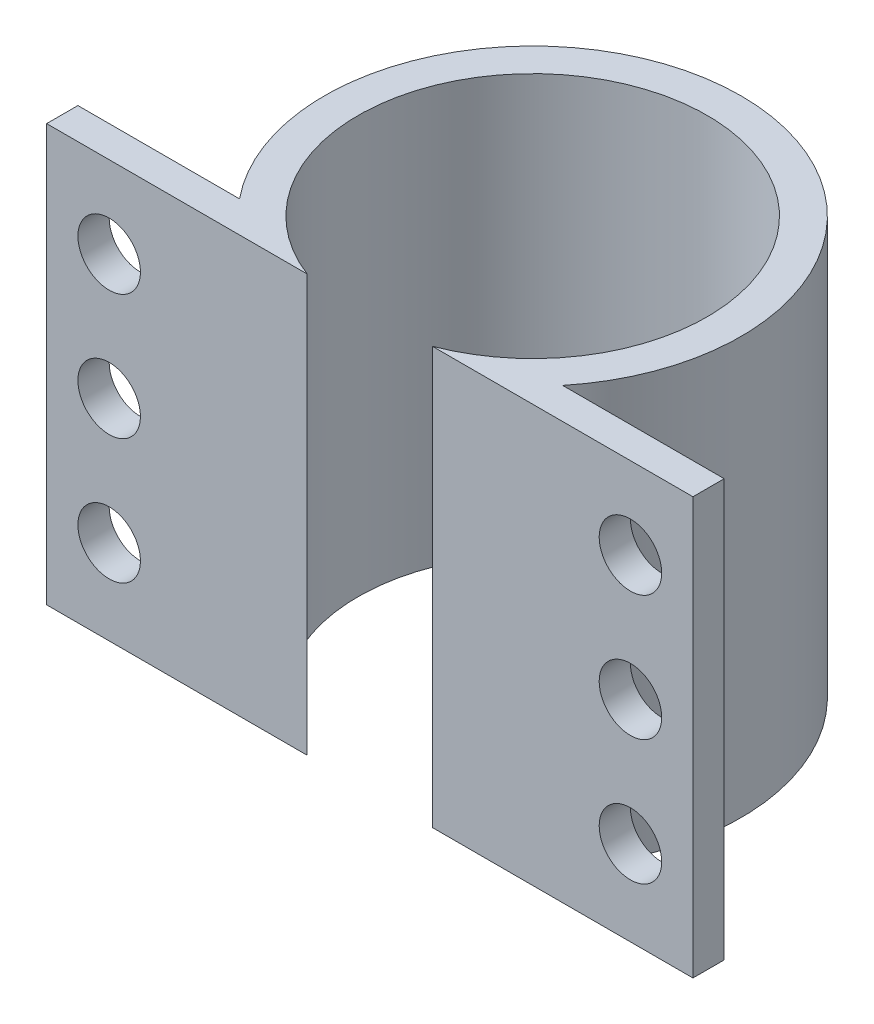
ISO-10303-21;
HEADER;
FILE_DESCRIPTION(('STEP AP214'),'2;1');
FILE_NAME('part.step','',(''),(''),'','','');
FILE_SCHEMA(('AUTOMOTIVE_DESIGN { 1 0 10303 214 1 1 1 1 }'));
ENDSEC;
DATA;
#1=APPLICATION_CONTEXT('core data for automotive mechanical design processes');
#2=APPLICATION_PROTOCOL_DEFINITION('international standard','automotive_design',2000,#1);
#3=PRODUCT_CONTEXT('',#1,'mechanical');
#4=PRODUCT('Part','Part','',(#3));
#5=PRODUCT_RELATED_PRODUCT_CATEGORY('part','',(#4));
#6=PRODUCT_DEFINITION_FORMATION('','',#4);
#7=PRODUCT_DEFINITION_CONTEXT('part definition',#1,'design');
#8=PRODUCT_DEFINITION('design','',#6,#7);
#9=PRODUCT_DEFINITION_SHAPE('','',#8);
#10=(LENGTH_UNIT() NAMED_UNIT(*) SI_UNIT(.MILLI.,.METRE.));
#11=(NAMED_UNIT(*) PLANE_ANGLE_UNIT() SI_UNIT($,.RADIAN.));
#12=(NAMED_UNIT(*) SI_UNIT($,.STERADIAN.) SOLID_ANGLE_UNIT());
#13=UNCERTAINTY_MEASURE_WITH_UNIT(LENGTH_MEASURE(1.E-05),#10,'distance_accuracy_value','');
#14=(GEOMETRIC_REPRESENTATION_CONTEXT(3) GLOBAL_UNCERTAINTY_ASSIGNED_CONTEXT((#13)) GLOBAL_UNIT_ASSIGNED_CONTEXT((#10,
#11,#12)) REPRESENTATION_CONTEXT('',''));
#15=CARTESIAN_POINT('',(0.,0.,0.));
#16=DIRECTION('',(0.,0.,1.));
#17=DIRECTION('',(1.,0.,0.));
#18=AXIS2_PLACEMENT_3D('',#15,#16,#17);
#19=CARTESIAN_POINT('',(0.,40.,0.));
#20=DIRECTION('',(0.,-1.,0.));
#21=DIRECTION('',(0.,0.,-1.));
#22=AXIS2_PLACEMENT_3D('',#19,#20,#21);
#23=CYLINDRICAL_SURFACE('',#22,16.75);
#24=CARTESIAN_POINT('',(0.,0.,0.));
#25=DIRECTION('',(0.,-1.,0.));
#26=DIRECTION('',(0.,0.,1.));
#27=AXIS2_PLACEMENT_3D('',#24,#25,#26);
#28=CIRCLE('',#27,16.75);
#29=CARTESIAN_POINT('',(-6.01343403463353,0.,15.6333333333333));
#30=VERTEX_POINT('',#29);
#31=CARTESIAN_POINT('',(6.01343403463353,0.,15.6333333333333));
#32=VERTEX_POINT('',#31);
#33=EDGE_CURVE('E135',#30,#32,#28,.T.);
#34=ORIENTED_EDGE('',*,*,#33,.T.);
#35=DIRECTION('',(0.,-1.,0.));
#36=VECTOR('',#35,1.);
#37=CARTESIAN_POINT('',(6.01343403463353,40.,15.6333333333333));
#38=LINE('',#37,#36);
#39=CARTESIAN_POINT('',(6.01343403463353,40.,15.6333333333333));
#40=VERTEX_POINT('',#39);
#41=EDGE_CURVE('E11',#40,#32,#38,.T.);
#42=ORIENTED_EDGE('',*,*,#41,.F.);
#43=CARTESIAN_POINT('',(0.,40.,0.));
#44=DIRECTION('',(0.,-1.,0.));
#45=DIRECTION('',(0.,0.,1.));
#46=AXIS2_PLACEMENT_3D('',#43,#44,#45);
#47=CIRCLE('',#46,16.75);
#48=CARTESIAN_POINT('',(-6.01343403463353,40.,15.6333333333333));
#49=VERTEX_POINT('',#48);
#50=EDGE_CURVE('E150',#49,#40,#47,.T.);
#51=ORIENTED_EDGE('',*,*,#50,.F.);
#52=DIRECTION('',(0.,-1.,0.));
#53=VECTOR('',#52,1.);
#54=CARTESIAN_POINT('',(-6.01343403463353,40.,15.6333333333333));
#55=LINE('',#54,#53);
#56=EDGE_CURVE('E131',#49,#30,#55,.T.);
#57=ORIENTED_EDGE('',*,*,#56,.T.);
#58=EDGE_LOOP('',(#34,#42,#51,#57));
#59=FACE_BOUND('',#58,.T.);
#60=ADVANCED_FACE('F37',(#59),#23,.F.);
#61=CARTESIAN_POINT('',(6.01343403463353,40.,15.6333333333333));
#62=DIRECTION('',(0.,0.,-1.));
#63=DIRECTION('',(-1.,0.,0.));
#64=AXIS2_PLACEMENT_3D('',#61,#62,#63);
#65=PLANE('',#64);
#66=CARTESIAN_POINT('',(25.0134340346335,32.1544315346818,15.6333333333333));
#67=DIRECTION('',(0.,0.,-1.));
#68=DIRECTION('',(-1.,0.,0.));
#69=AXIS2_PLACEMENT_3D('',#66,#67,#68);
#70=CIRCLE('',#69,3.);
#71=CARTESIAN_POINT('',(22.0134340346335,32.1544315346818,15.6333333333333));
#72=VERTEX_POINT('',#71);
#73=EDGE_CURVE('E139',#72,#72,#70,.T.);
#74=ORIENTED_EDGE('',*,*,#73,.T.);
#75=EDGE_LOOP('',(#74));
#76=FACE_BOUND('',#75,.T.);
#77=CARTESIAN_POINT('',(25.0134340346335,8.15443153468184,15.6333333333333));
#78=DIRECTION('',(0.,0.,-1.));
#79=DIRECTION('',(-1.,0.,0.));
#80=AXIS2_PLACEMENT_3D('',#77,#78,#79);
#81=CIRCLE('',#80,2.99999999999999);
#82=CARTESIAN_POINT('',(22.0134340346335,8.15443153468184,15.6333333333333));
#83=VERTEX_POINT('',#82);
#84=EDGE_CURVE('E174',#83,#83,#81,.T.);
#85=ORIENTED_EDGE('',*,*,#84,.T.);
#86=EDGE_LOOP('',(#85));
#87=FACE_BOUND('',#86,.T.);
#88=CARTESIAN_POINT('',(25.0134340346335,20.1544315346818,15.6333333333333));
#89=DIRECTION('',(0.,0.,-1.));
#90=DIRECTION('',(-1.,0.,0.));
#91=AXIS2_PLACEMENT_3D('',#88,#89,#90);
#92=CIRCLE('',#91,3.);
#93=CARTESIAN_POINT('',(22.0134340346335,20.1544315346818,15.6333333333333));
#94=VERTEX_POINT('',#93);
#95=EDGE_CURVE('E170',#94,#94,#92,.T.);
#96=ORIENTED_EDGE('',*,*,#95,.T.);
#97=EDGE_LOOP('',(#96));
#98=FACE_BOUND('',#97,.T.);
#99=DIRECTION('',(1.,0.,0.));
#100=VECTOR('',#99,1.);
#101=CARTESIAN_POINT('',(6.01343403463353,0.,15.6333333333333));
#102=LINE('',#101,#100);
#103=CARTESIAN_POINT('',(31.0134340346335,0.,15.6333333333333));
#104=VERTEX_POINT('',#103);
#105=EDGE_CURVE('E138',#32,#104,#102,.T.);
#106=ORIENTED_EDGE('',*,*,#105,.T.);
#107=DIRECTION('',(0.,-1.,0.));
#108=VECTOR('',#107,1.);
#109=CARTESIAN_POINT('',(31.0134340346335,40.,15.6333333333333));
#110=LINE('',#109,#108);
#111=CARTESIAN_POINT('',(31.0134340346335,40.,15.6333333333333));
#112=VERTEX_POINT('',#111);
#113=EDGE_CURVE('E46',#112,#104,#110,.T.);
#114=ORIENTED_EDGE('',*,*,#113,.F.);
#115=DIRECTION('',(1.,0.,0.));
#116=VECTOR('',#115,1.);
#117=CARTESIAN_POINT('',(6.01343403463353,40.,15.6333333333333));
#118=LINE('',#117,#116);
#119=EDGE_CURVE('E98',#40,#112,#118,.T.);
#120=ORIENTED_EDGE('',*,*,#119,.F.);
#121=ORIENTED_EDGE('',*,*,#41,.T.);
#122=EDGE_LOOP('',(#106,#114,#120,#121));
#123=FACE_BOUND('',#122,.T.);
#124=ADVANCED_FACE('F218',(#76,#87,#98,#123),#65,.F.);
#125=CARTESIAN_POINT('',(31.0134340346335,40.,15.6333333333333));
#126=DIRECTION('',(-1.,0.,0.));
#127=DIRECTION('',(0.,0.,1.));
#128=AXIS2_PLACEMENT_3D('',#125,#126,#127);
#129=PLANE('',#128);
#130=DIRECTION('',(0.,0.,-1.));
#131=VECTOR('',#130,1.);
#132=CARTESIAN_POINT('',(31.0134340346335,0.,15.6333333333333));
#133=LINE('',#132,#131);
#134=CARTESIAN_POINT('',(31.0134340346335,0.,12.6333333333333));
#135=VERTEX_POINT('',#134);
#136=EDGE_CURVE('E141',#104,#135,#133,.T.);
#137=ORIENTED_EDGE('',*,*,#136,.T.);
#138=DIRECTION('',(0.,-1.,0.));
#139=VECTOR('',#138,1.);
#140=CARTESIAN_POINT('',(31.0134340346335,40.,12.6333333333333));
#141=LINE('',#140,#139);
#142=CARTESIAN_POINT('',(31.0134340346335,40.,12.6333333333333));
#143=VERTEX_POINT('',#142);
#144=EDGE_CURVE('E157',#143,#135,#141,.T.);
#145=ORIENTED_EDGE('',*,*,#144,.F.);
#146=DIRECTION('',(0.,0.,-1.));
#147=VECTOR('',#146,1.);
#148=CARTESIAN_POINT('',(31.0134340346335,40.,15.6333333333333));
#149=LINE('',#148,#147);
#150=EDGE_CURVE('E187',#112,#143,#149,.T.);
#151=ORIENTED_EDGE('',*,*,#150,.F.);
#152=ORIENTED_EDGE('',*,*,#113,.T.);
#153=EDGE_LOOP('',(#137,#145,#151,#152));
#154=FACE_BOUND('',#153,.T.);
#155=ADVANCED_FACE('F222',(#154),#129,.F.);
#156=CARTESIAN_POINT('',(15.5048021235,40.,12.6333333333333));
#157=DIRECTION('',(0.,0.,1.));
#158=DIRECTION('',(1.,0.,0.));
#159=AXIS2_PLACEMENT_3D('',#156,#157,#158);
#160=PLANE('',#159);
#161=CARTESIAN_POINT('',(25.0134340346335,32.1544315346818,12.6333333333333));
#162=DIRECTION('',(0.,0.,-1.));
#163=DIRECTION('',(1.,0.,0.));
#164=AXIS2_PLACEMENT_3D('',#161,#162,#163);
#165=CIRCLE('',#164,3.);
#166=CARTESIAN_POINT('',(28.0134340346335,32.1544315346818,12.6333333333333));
#167=VERTEX_POINT('',#166);
#168=EDGE_CURVE('E253',#167,#167,#165,.T.);
#169=ORIENTED_EDGE('',*,*,#168,.F.);
#170=EDGE_LOOP('',(#169));
#171=FACE_BOUND('',#170,.T.);
#172=CARTESIAN_POINT('',(25.0134340346335,8.15443153468184,12.6333333333333));
#173=DIRECTION('',(0.,0.,-1.));
#174=DIRECTION('',(1.,0.,0.));
#175=AXIS2_PLACEMENT_3D('',#172,#173,#174);
#176=CIRCLE('',#175,2.99999999999999);
#177=CARTESIAN_POINT('',(28.0134340346335,8.15443153468184,12.6333333333333));
#178=VERTEX_POINT('',#177);
#179=EDGE_CURVE('E259',#178,#178,#176,.T.);
#180=ORIENTED_EDGE('',*,*,#179,.F.);
#181=EDGE_LOOP('',(#180));
#182=FACE_BOUND('',#181,.T.);
#183=CARTESIAN_POINT('',(25.0134340346335,20.1544315346818,12.6333333333333));
#184=DIRECTION('',(0.,0.,-1.));
#185=DIRECTION('',(1.,0.,0.));
#186=AXIS2_PLACEMENT_3D('',#183,#184,#185);
#187=CIRCLE('',#186,3.);
#188=CARTESIAN_POINT('',(28.0134340346335,20.1544315346818,12.6333333333333));
#189=VERTEX_POINT('',#188);
#190=EDGE_CURVE('E256',#189,#189,#187,.T.);
#191=ORIENTED_EDGE('',*,*,#190,.F.);
#192=EDGE_LOOP('',(#191));
#193=FACE_BOUND('',#192,.T.);
#194=DIRECTION('',(-1.,0.,0.));
#195=VECTOR('',#194,1.);
#196=CARTESIAN_POINT('',(15.5048021235,0.,12.6333333333333));
#197=LINE('',#196,#195);
#198=CARTESIAN_POINT('',(15.5048021235,0.,12.6333333333333));
#199=VERTEX_POINT('',#198);
#200=EDGE_CURVE('E143',#135,#199,#197,.T.);
#201=ORIENTED_EDGE('',*,*,#200,.T.);
#202=DIRECTION('',(0.,-1.,0.));
#203=VECTOR('',#202,1.);
#204=CARTESIAN_POINT('',(15.5048021235,40.,12.6333333333333));
#205=LINE('',#204,#203);
#206=CARTESIAN_POINT('',(15.5048021235,40.,12.6333333333333));
#207=VERTEX_POINT('',#206);
#208=EDGE_CURVE('E154',#207,#199,#205,.T.);
#209=ORIENTED_EDGE('',*,*,#208,.F.);
#210=DIRECTION('',(-1.,0.,0.));
#211=VECTOR('',#210,1.);
#212=CARTESIAN_POINT('',(15.5048021235,40.,12.6333333333333));
#213=LINE('',#212,#211);
#214=EDGE_CURVE('E189',#143,#207,#213,.T.);
#215=ORIENTED_EDGE('',*,*,#214,.F.);
#216=ORIENTED_EDGE('',*,*,#144,.T.);
#217=EDGE_LOOP('',(#201,#209,#215,#216));
#218=FACE_BOUND('',#217,.T.);
#219=ADVANCED_FACE('F195',(#171,#182,#193,#218),#160,.F.);
#220=CARTESIAN_POINT('',(0.,40.,0.));
#221=DIRECTION('',(0.,-1.,0.));
#222=DIRECTION('',(0.,0.,-1.));
#223=AXIS2_PLACEMENT_3D('',#220,#221,#222);
#224=CYLINDRICAL_SURFACE('',#223,20.);
#225=CARTESIAN_POINT('',(0.,0.,0.));
#226=DIRECTION('',(0.,1.,0.));
#227=DIRECTION('',(0.,0.,1.));
#228=AXIS2_PLACEMENT_3D('',#225,#226,#227);
#229=CIRCLE('',#228,20.);
#230=CARTESIAN_POINT('',(-15.5048021235,0.,12.6333333333333));
#231=VERTEX_POINT('',#230);
#232=EDGE_CURVE('E145',#199,#231,#229,.T.);
#233=ORIENTED_EDGE('',*,*,#232,.T.);
#234=DIRECTION('',(0.,-1.,0.));
#235=VECTOR('',#234,1.);
#236=CARTESIAN_POINT('',(-15.5048021235,40.,12.6333333333333));
#237=LINE('',#236,#235);
#238=CARTESIAN_POINT('',(-15.5048021235,40.,12.6333333333333));
#239=VERTEX_POINT('',#238);
#240=EDGE_CURVE('E126',#239,#231,#237,.T.);
#241=ORIENTED_EDGE('',*,*,#240,.F.);
#242=CARTESIAN_POINT('',(0.,40.,0.));
#243=DIRECTION('',(0.,1.,0.));
#244=DIRECTION('',(0.,0.,1.));
#245=AXIS2_PLACEMENT_3D('',#242,#243,#244);
#246=CIRCLE('',#245,20.);
#247=EDGE_CURVE('E117',#207,#239,#246,.T.);
#248=ORIENTED_EDGE('',*,*,#247,.F.);
#249=ORIENTED_EDGE('',*,*,#208,.T.);
#250=EDGE_LOOP('',(#233,#241,#248,#249));
#251=FACE_BOUND('',#250,.T.);
#252=ADVANCED_FACE('F199',(#251),#224,.T.);
#253=CARTESIAN_POINT('',(-31.0134340346335,40.,12.6333333333333));
#254=DIRECTION('',(0.,0.,1.));
#255=DIRECTION('',(1.,0.,0.));
#256=AXIS2_PLACEMENT_3D('',#253,#254,#255);
#257=PLANE('',#256);
#258=CARTESIAN_POINT('',(-25.0134340346335,20.1544315346818,12.6333333333333));
#259=DIRECTION('',(0.,0.,-1.));
#260=DIRECTION('',(-1.,0.,0.));
#261=AXIS2_PLACEMENT_3D('',#258,#259,#260);
#262=CIRCLE('',#261,3.);
#263=CARTESIAN_POINT('',(-28.0134340346335,20.1544315346818,12.6333333333333));
#264=VERTEX_POINT('',#263);
#265=EDGE_CURVE('E243',#264,#264,#262,.T.);
#266=ORIENTED_EDGE('',*,*,#265,.F.);
#267=EDGE_LOOP('',(#266));
#268=FACE_BOUND('',#267,.T.);
#269=CARTESIAN_POINT('',(-25.0134340346335,32.1544315346818,12.6333333333333));
#270=DIRECTION('',(0.,0.,-1.));
#271=DIRECTION('',(-1.,0.,0.));
#272=AXIS2_PLACEMENT_3D('',#269,#270,#271);
#273=CIRCLE('',#272,3.);
#274=CARTESIAN_POINT('',(-28.0134340346335,32.1544315346818,12.6333333333333));
#275=VERTEX_POINT('',#274);
#276=EDGE_CURVE('E247',#275,#275,#273,.T.);
#277=ORIENTED_EDGE('',*,*,#276,.F.);
#278=EDGE_LOOP('',(#277));
#279=FACE_BOUND('',#278,.T.);
#280=CARTESIAN_POINT('',(-25.0134340346335,8.15443153468184,12.6333333333333));
#281=DIRECTION('',(0.,0.,-1.));
#282=DIRECTION('',(-1.,0.,0.));
#283=AXIS2_PLACEMENT_3D('',#280,#281,#282);
#284=CIRCLE('',#283,2.99999999999999);
#285=CARTESIAN_POINT('',(-28.0134340346335,8.15443153468184,12.6333333333333));
#286=VERTEX_POINT('',#285);
#287=EDGE_CURVE('E165',#286,#286,#284,.T.);
#288=ORIENTED_EDGE('',*,*,#287,.F.);
#289=EDGE_LOOP('',(#288));
#290=FACE_BOUND('',#289,.T.);
#291=DIRECTION('',(-1.,0.,0.));
#292=VECTOR('',#291,1.);
#293=CARTESIAN_POINT('',(-31.0134340346335,0.,12.6333333333333));
#294=LINE('',#293,#292);
#295=CARTESIAN_POINT('',(-31.0134340346335,0.,12.6333333333333));
#296=VERTEX_POINT('',#295);
#297=EDGE_CURVE('E125',#231,#296,#294,.T.);
#298=ORIENTED_EDGE('',*,*,#297,.T.);
#299=DIRECTION('',(0.,-1.,0.));
#300=VECTOR('',#299,1.);
#301=CARTESIAN_POINT('',(-31.0134340346335,40.,12.6333333333333));
#302=LINE('',#301,#300);
#303=CARTESIAN_POINT('',(-31.0134340346335,40.,12.6333333333333));
#304=VERTEX_POINT('',#303);
#305=EDGE_CURVE('E122',#304,#296,#302,.T.);
#306=ORIENTED_EDGE('',*,*,#305,.F.);
#307=DIRECTION('',(-1.,0.,0.));
#308=VECTOR('',#307,1.);
#309=CARTESIAN_POINT('',(-31.0134340346335,40.,12.6333333333333));
#310=LINE('',#309,#308);
#311=EDGE_CURVE('E111',#239,#304,#310,.T.);
#312=ORIENTED_EDGE('',*,*,#311,.F.);
#313=ORIENTED_EDGE('',*,*,#240,.T.);
#314=EDGE_LOOP('',(#298,#306,#312,#313));
#315=FACE_BOUND('',#314,.T.);
#316=ADVANCED_FACE('F123',(#268,#279,#290,#315),#257,.F.);
#317=CARTESIAN_POINT('',(-31.0134340346335,40.,12.6333333333333));
#318=DIRECTION('',(1.,0.,0.));
#319=DIRECTION('',(0.,0.,-1.));
#320=AXIS2_PLACEMENT_3D('',#317,#318,#319);
#321=PLANE('',#320);
#322=DIRECTION('',(0.,0.,1.));
#323=VECTOR('',#322,1.);
#324=CARTESIAN_POINT('',(-31.0134340346335,0.,12.6333333333333));
#325=LINE('',#324,#323);
#326=CARTESIAN_POINT('',(-31.0134340346335,0.,15.6333333333333));
#327=VERTEX_POINT('',#326);
#328=EDGE_CURVE('E84',#296,#327,#325,.T.);
#329=ORIENTED_EDGE('',*,*,#328,.T.);
#330=DIRECTION('',(0.,-1.,0.));
#331=VECTOR('',#330,1.);
#332=CARTESIAN_POINT('',(-31.0134340346335,40.,15.6333333333333));
#333=LINE('',#332,#331);
#334=CARTESIAN_POINT('',(-31.0134340346335,40.,15.6333333333333));
#335=VERTEX_POINT('',#334);
#336=EDGE_CURVE('E127',#335,#327,#333,.T.);
#337=ORIENTED_EDGE('',*,*,#336,.F.);
#338=DIRECTION('',(0.,0.,1.));
#339=VECTOR('',#338,1.);
#340=CARTESIAN_POINT('',(-31.0134340346335,40.,12.6333333333333));
#341=LINE('',#340,#339);
#342=EDGE_CURVE('E115',#304,#335,#341,.T.);
#343=ORIENTED_EDGE('',*,*,#342,.F.);
#344=ORIENTED_EDGE('',*,*,#305,.T.);
#345=EDGE_LOOP('',(#329,#337,#343,#344));
#346=FACE_BOUND('',#345,.T.);
#347=ADVANCED_FACE('F129',(#346),#321,.F.);
#348=CARTESIAN_POINT('',(-31.0134340346335,40.,15.6333333333333));
#349=DIRECTION('',(0.,0.,-1.));
#350=DIRECTION('',(-1.,0.,0.));
#351=AXIS2_PLACEMENT_3D('',#348,#349,#350);
#352=PLANE('',#351);
#353=CARTESIAN_POINT('',(-25.0134340346335,20.1544315346818,15.6333333333333));
#354=DIRECTION('',(0.,0.,-1.));
#355=DIRECTION('',(-1.,0.,0.));
#356=AXIS2_PLACEMENT_3D('',#353,#354,#355);
#357=CIRCLE('',#356,3.);
#358=CARTESIAN_POINT('',(-28.0134340346335,20.1544315346818,15.6333333333333));
#359=VERTEX_POINT('',#358);
#360=EDGE_CURVE('E40',#359,#359,#357,.T.);
#361=ORIENTED_EDGE('',*,*,#360,.T.);
#362=EDGE_LOOP('',(#361));
#363=FACE_BOUND('',#362,.T.);
#364=CARTESIAN_POINT('',(-25.0134340346335,32.1544315346818,15.6333333333333));
#365=DIRECTION('',(0.,0.,-1.));
#366=DIRECTION('',(-1.,0.,0.));
#367=AXIS2_PLACEMENT_3D('',#364,#365,#366);
#368=CIRCLE('',#367,3.);
#369=CARTESIAN_POINT('',(-28.0134340346335,32.1544315346818,15.6333333333333));
#370=VERTEX_POINT('',#369);
#371=EDGE_CURVE('E164',#370,#370,#368,.T.);
#372=ORIENTED_EDGE('',*,*,#371,.T.);
#373=EDGE_LOOP('',(#372));
#374=FACE_BOUND('',#373,.T.);
#375=CARTESIAN_POINT('',(-25.0134340346335,8.15443153468184,15.6333333333333));
#376=DIRECTION('',(0.,0.,-1.));
#377=DIRECTION('',(-1.,0.,0.));
#378=AXIS2_PLACEMENT_3D('',#375,#376,#377);
#379=CIRCLE('',#378,2.99999999999999);
#380=CARTESIAN_POINT('',(-28.0134340346335,8.15443153468184,15.6333333333333));
#381=VERTEX_POINT('',#380);
#382=EDGE_CURVE('E162',#381,#381,#379,.T.);
#383=ORIENTED_EDGE('',*,*,#382,.T.);
#384=EDGE_LOOP('',(#383));
#385=FACE_BOUND('',#384,.T.);
#386=DIRECTION('',(1.,0.,0.));
#387=VECTOR('',#386,1.);
#388=CARTESIAN_POINT('',(-31.0134340346335,0.,15.6333333333333));
#389=LINE('',#388,#387);
#390=EDGE_CURVE('E90',#327,#30,#389,.T.);
#391=ORIENTED_EDGE('',*,*,#390,.T.);
#392=ORIENTED_EDGE('',*,*,#56,.F.);
#393=DIRECTION('',(1.,0.,0.));
#394=VECTOR('',#393,1.);
#395=CARTESIAN_POINT('',(-31.0134340346335,40.,15.6333333333333));
#396=LINE('',#395,#394);
#397=EDGE_CURVE('E55',#335,#49,#396,.T.);
#398=ORIENTED_EDGE('',*,*,#397,.F.);
#399=ORIENTED_EDGE('',*,*,#336,.T.);
#400=EDGE_LOOP('',(#391,#392,#398,#399));
#401=FACE_BOUND('',#400,.T.);
#402=ADVANCED_FACE('F207',(#363,#374,#385,#401),#352,.F.);
#403=CARTESIAN_POINT('',(0.,40.,0.));
#404=DIRECTION('',(0.,1.,0.));
#405=DIRECTION('',(0.,0.,1.));
#406=AXIS2_PLACEMENT_3D('',#403,#404,#405);
#407=PLANE('',#406);
#408=ORIENTED_EDGE('',*,*,#50,.T.);
#409=ORIENTED_EDGE('',*,*,#119,.T.);
#410=ORIENTED_EDGE('',*,*,#150,.T.);
#411=ORIENTED_EDGE('',*,*,#214,.T.);
#412=ORIENTED_EDGE('',*,*,#247,.T.);
#413=ORIENTED_EDGE('',*,*,#311,.T.);
#414=ORIENTED_EDGE('',*,*,#342,.T.);
#415=ORIENTED_EDGE('',*,*,#397,.T.);
#416=EDGE_LOOP('',(#408,#409,#410,#411,#412,#413,#414,#415));
#417=FACE_BOUND('',#416,.T.);
#418=ADVANCED_FACE('F113',(#417),#407,.T.);
#419=CARTESIAN_POINT('',(0.,0.,0.));
#420=DIRECTION('',(0.,1.,0.));
#421=DIRECTION('',(0.,0.,1.));
#422=AXIS2_PLACEMENT_3D('',#419,#420,#421);
#423=PLANE('',#422);
#424=ORIENTED_EDGE('',*,*,#33,.F.);
#425=ORIENTED_EDGE('',*,*,#390,.F.);
#426=ORIENTED_EDGE('',*,*,#328,.F.);
#427=ORIENTED_EDGE('',*,*,#297,.F.);
#428=ORIENTED_EDGE('',*,*,#232,.F.);
#429=ORIENTED_EDGE('',*,*,#200,.F.);
#430=ORIENTED_EDGE('',*,*,#136,.F.);
#431=ORIENTED_EDGE('',*,*,#105,.F.);
#432=EDGE_LOOP('',(#424,#425,#426,#427,#428,#429,#430,#431));
#433=FACE_BOUND('',#432,.T.);
#434=ADVANCED_FACE('F202',(#433),#423,.F.);
#435=CARTESIAN_POINT('',(-25.0134340346335,8.15443153468184,22.6333333333333));
#436=DIRECTION('',(0.,0.,-1.));
#437=DIRECTION('',(-1.,0.,0.));
#438=AXIS2_PLACEMENT_3D('',#435,#436,#437);
#439=CYLINDRICAL_SURFACE('',#438,2.99999999999999);
#440=ORIENTED_EDGE('',*,*,#287,.T.);
#441=EDGE_LOOP('',(#440));
#442=FACE_BOUND('',#441,.T.);
#443=ORIENTED_EDGE('',*,*,#382,.F.);
#444=EDGE_LOOP('',(#443));
#445=FACE_BOUND('',#444,.T.);
#446=ADVANCED_FACE('F284',(#442,#445),#439,.F.);
#447=CARTESIAN_POINT('',(-25.0134340346335,32.1544315346818,22.6333333333333));
#448=DIRECTION('',(0.,0.,-1.));
#449=DIRECTION('',(-1.,0.,0.));
#450=AXIS2_PLACEMENT_3D('',#447,#448,#449);
#451=CYLINDRICAL_SURFACE('',#450,3.);
#452=ORIENTED_EDGE('',*,*,#276,.T.);
#453=EDGE_LOOP('',(#452));
#454=FACE_BOUND('',#453,.T.);
#455=ORIENTED_EDGE('',*,*,#371,.F.);
#456=EDGE_LOOP('',(#455));
#457=FACE_BOUND('',#456,.T.);
#458=ADVANCED_FACE('F279',(#454,#457),#451,.F.);
#459=CARTESIAN_POINT('',(-25.0134340346335,20.1544315346818,22.6333333333333));
#460=DIRECTION('',(0.,0.,-1.));
#461=DIRECTION('',(-1.,0.,0.));
#462=AXIS2_PLACEMENT_3D('',#459,#460,#461);
#463=CYLINDRICAL_SURFACE('',#462,3.);
#464=ORIENTED_EDGE('',*,*,#265,.T.);
#465=EDGE_LOOP('',(#464));
#466=FACE_BOUND('',#465,.T.);
#467=ORIENTED_EDGE('',*,*,#360,.F.);
#468=EDGE_LOOP('',(#467));
#469=FACE_BOUND('',#468,.T.);
#470=ADVANCED_FACE('F271',(#466,#469),#463,.F.);
#471=CARTESIAN_POINT('',(25.0134340346335,20.1544315346818,22.6333333333333));
#472=DIRECTION('',(0.,0.,-1.));
#473=DIRECTION('',(-1.,0.,0.));
#474=AXIS2_PLACEMENT_3D('',#471,#472,#473);
#475=CYLINDRICAL_SURFACE('',#474,3.);
#476=ORIENTED_EDGE('',*,*,#190,.T.);
#477=EDGE_LOOP('',(#476));
#478=FACE_BOUND('',#477,.T.);
#479=ORIENTED_EDGE('',*,*,#95,.F.);
#480=EDGE_LOOP('',(#479));
#481=FACE_BOUND('',#480,.T.);
#482=ADVANCED_FACE('F266',(#478,#481),#475,.F.);
#483=CARTESIAN_POINT('',(25.0134340346335,8.15443153468184,22.6333333333333));
#484=DIRECTION('',(0.,0.,-1.));
#485=DIRECTION('',(-1.,0.,0.));
#486=AXIS2_PLACEMENT_3D('',#483,#484,#485);
#487=CYLINDRICAL_SURFACE('',#486,2.99999999999999);
#488=ORIENTED_EDGE('',*,*,#179,.T.);
#489=EDGE_LOOP('',(#488));
#490=FACE_BOUND('',#489,.T.);
#491=ORIENTED_EDGE('',*,*,#84,.F.);
#492=EDGE_LOOP('',(#491));
#493=FACE_BOUND('',#492,.T.);
#494=ADVANCED_FACE('F270',(#490,#493),#487,.F.);
#495=CARTESIAN_POINT('',(25.0134340346335,32.1544315346818,22.6333333333333));
#496=DIRECTION('',(0.,0.,-1.));
#497=DIRECTION('',(-1.,0.,0.));
#498=AXIS2_PLACEMENT_3D('',#495,#496,#497);
#499=CYLINDRICAL_SURFACE('',#498,3.);
#500=ORIENTED_EDGE('',*,*,#168,.T.);
#501=EDGE_LOOP('',(#500));
#502=FACE_BOUND('',#501,.T.);
#503=ORIENTED_EDGE('',*,*,#73,.F.);
#504=EDGE_LOOP('',(#503));
#505=FACE_BOUND('',#504,.T.);
#506=ADVANCED_FACE('F277',(#502,#505),#499,.F.);
#507=CLOSED_SHELL('',(#60,#124,#155,#219,#252,#316,#347,#402,#418,#434,#446,#458,#470,#482,#494,#506));
#508=MANIFOLD_SOLID_BREP('B2',#507);
#509=ADVANCED_BREP_SHAPE_REPRESENTATION('',(#18,#508),#14);
#510=SHAPE_DEFINITION_REPRESENTATION(#9,#509);
ENDSEC;
END-ISO-10303-21;
